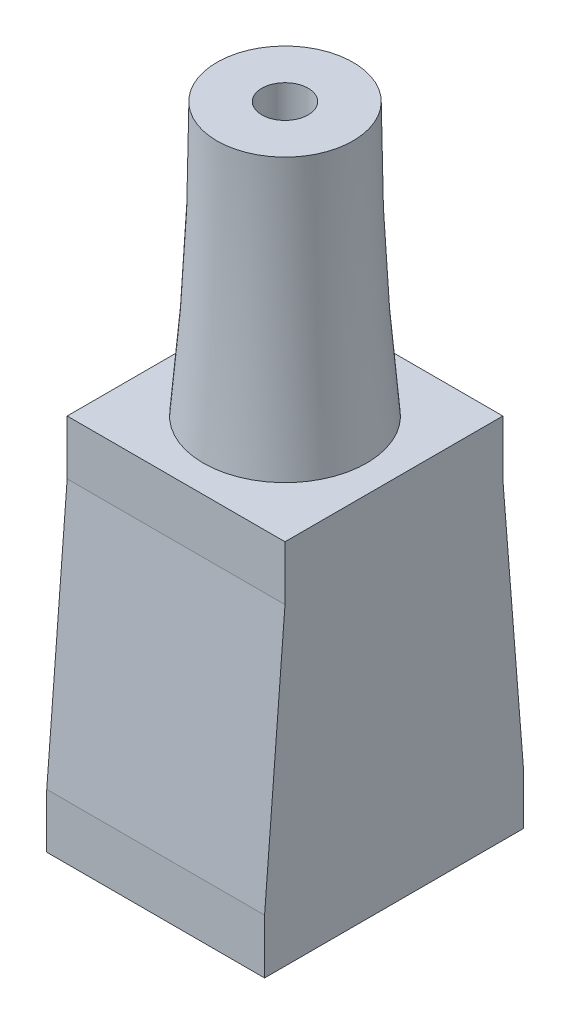
ISO-10303-21;
HEADER;
FILE_DESCRIPTION(('STEP AP214'),'2;1');
FILE_NAME('part.step','',(''),(''),'','','');
FILE_SCHEMA(('AUTOMOTIVE_DESIGN { 1 0 10303 214 1 1 1 1 }'));
ENDSEC;
DATA;
#1=APPLICATION_CONTEXT('core data for automotive mechanical design processes');
#2=APPLICATION_PROTOCOL_DEFINITION('international standard','automotive_design',2000,#1);
#3=PRODUCT_CONTEXT('',#1,'mechanical');
#4=PRODUCT('Part','Part','',(#3));
#5=PRODUCT_RELATED_PRODUCT_CATEGORY('part','',(#4));
#6=PRODUCT_DEFINITION_FORMATION('','',#4);
#7=PRODUCT_DEFINITION_CONTEXT('part definition',#1,'design');
#8=PRODUCT_DEFINITION('design','',#6,#7);
#9=PRODUCT_DEFINITION_SHAPE('','',#8);
#10=(LENGTH_UNIT() NAMED_UNIT(*) SI_UNIT(.MILLI.,.METRE.));
#11=(NAMED_UNIT(*) PLANE_ANGLE_UNIT() SI_UNIT($,.RADIAN.));
#12=(NAMED_UNIT(*) SI_UNIT($,.STERADIAN.) SOLID_ANGLE_UNIT());
#13=UNCERTAINTY_MEASURE_WITH_UNIT(LENGTH_MEASURE(1.E-05),#10,'distance_accuracy_value','');
#14=(GEOMETRIC_REPRESENTATION_CONTEXT(3) GLOBAL_UNCERTAINTY_ASSIGNED_CONTEXT((#13)) GLOBAL_UNIT_ASSIGNED_CONTEXT((#10,
#11,#12)) REPRESENTATION_CONTEXT('',''));
#15=CARTESIAN_POINT('',(0.,0.,0.));
#16=DIRECTION('',(0.,0.,1.));
#17=DIRECTION('',(1.,0.,0.));
#18=AXIS2_PLACEMENT_3D('',#15,#16,#17);
#19=CARTESIAN_POINT('',(0.,0.,0.));
#20=DIRECTION('',(0.,1.,0.));
#21=DIRECTION('',(0.,0.,1.));
#22=AXIS2_PLACEMENT_3D('',#19,#20,#21);
#23=CYLINDRICAL_SURFACE('',#22,0.85);
#24=CARTESIAN_POINT('',(0.,13.5,0.));
#25=DIRECTION('',(0.,1.,0.));
#26=DIRECTION('',(0.,0.,1.));
#27=AXIS2_PLACEMENT_3D('',#24,#25,#26);
#28=CIRCLE('',#27,0.85);
#29=CARTESIAN_POINT('',(0.,13.5,0.85));
#30=VERTEX_POINT('',#29);
#31=EDGE_CURVE('E44',#30,#30,#28,.T.);
#32=ORIENTED_EDGE('',*,*,#31,.T.);
#33=EDGE_LOOP('',(#32));
#34=FACE_BOUND('',#33,.T.);
#35=CARTESIAN_POINT('',(0.,23.5,0.));
#36=DIRECTION('',(0.,1.,0.));
#37=DIRECTION('',(0.,0.,1.));
#38=AXIS2_PLACEMENT_3D('',#35,#36,#37);
#39=CIRCLE('',#38,0.85);
#40=CARTESIAN_POINT('',(0.,23.5,0.85));
#41=VERTEX_POINT('',#40);
#42=EDGE_CURVE('E54',#41,#41,#39,.T.);
#43=ORIENTED_EDGE('',*,*,#42,.F.);
#44=EDGE_LOOP('',(#43));
#45=FACE_BOUND('',#44,.T.);
#46=ADVANCED_FACE('F41',(#34,#45),#23,.T.);
#47=CARTESIAN_POINT('',(0.85,23.5,0.));
#48=DIRECTION('',(0.,-1.,0.));
#49=DIRECTION('',(0.,0.,-1.));
#50=AXIS2_PLACEMENT_3D('',#47,#48,#49);
#51=PLANE('',#50);
#52=ORIENTED_EDGE('',*,*,#42,.T.);
#53=EDGE_LOOP('',(#52));
#54=FACE_BOUND('',#53,.T.);
#55=CARTESIAN_POINT('',(0.,23.5,0.));
#56=DIRECTION('',(0.,1.,0.));
#57=DIRECTION('',(0.,0.,1.));
#58=AXIS2_PLACEMENT_3D('',#55,#56,#57);
#59=CIRCLE('',#58,2.5);
#60=CARTESIAN_POINT('',(0.,23.5,2.5));
#61=VERTEX_POINT('',#60);
#62=EDGE_CURVE('E48',#61,#61,#59,.T.);
#63=ORIENTED_EDGE('',*,*,#62,.F.);
#64=EDGE_LOOP('',(#63));
#65=FACE_BOUND('',#64,.T.);
#66=ADVANCED_FACE('F69',(#54,#65),#51,.T.);
#67=CARTESIAN_POINT('',(0.,23.5,0.));
#68=DIRECTION('',(0.,1.,0.));
#69=DIRECTION('',(0.,0.,1.));
#70=AXIS2_PLACEMENT_3D('',#67,#68,#69);
#71=TOROIDAL_SURFACE('',#70,102.75,100.25);
#72=ORIENTED_EDGE('',*,*,#62,.T.);
#73=EDGE_LOOP('',(#72));
#74=FACE_BOUND('',#73,.T.);
#75=CARTESIAN_POINT('',(0.,13.4999999999999,0.));
#76=DIRECTION('',(0.,1.,0.));
#77=DIRECTION('',(0.,0.,1.));
#78=AXIS2_PLACEMENT_3D('',#75,#76,#77);
#79=CIRCLE('',#78,3.);
#80=CARTESIAN_POINT('',(0.,13.4999999999999,3.));
#81=VERTEX_POINT('',#80);
#82=EDGE_CURVE('E11',#81,#81,#79,.T.);
#83=ORIENTED_EDGE('',*,*,#82,.F.);
#84=EDGE_LOOP('',(#83));
#85=FACE_BOUND('',#84,.T.);
#86=ADVANCED_FACE('F64',(#74,#85),#71,.T.);
#87=CARTESIAN_POINT('',(0.85,13.5,0.));
#88=DIRECTION('',(0.,1.,0.));
#89=DIRECTION('',(0.,0.,1.));
#90=AXIS2_PLACEMENT_3D('',#87,#88,#89);
#91=PLANE('',#90);
#92=ORIENTED_EDGE('',*,*,#82,.T.);
#93=EDGE_LOOP('',(#92));
#94=FACE_BOUND('',#93,.T.);
#95=ORIENTED_EDGE('',*,*,#31,.F.);
#96=EDGE_LOOP('',(#95));
#97=FACE_BOUND('',#96,.T.);
#98=ADVANCED_FACE('F42',(#94,#97),#91,.T.);
#99=OPEN_SHELL('',(#46,#66,#86,#98));
#100=SHELL_BASED_SURFACE_MODEL('B2',(#99));
#101=CARTESIAN_POINT('',(-4.,13.5,-4.));
#102=DIRECTION('',(0.,0.,1.));
#103=DIRECTION('',(1.,0.,0.));
#104=AXIS2_PLACEMENT_3D('',#101,#102,#103);
#105=PLANE('',#104);
#106=DIRECTION('',(1.,0.,0.));
#107=VECTOR('',#106,1.);
#108=CARTESIAN_POINT('',(-4.,13.5,-4.));
#109=LINE('',#108,#107);
#110=CARTESIAN_POINT('',(-4.,13.5,-4.));
#111=VERTEX_POINT('',#110);
#112=CARTESIAN_POINT('',(4.,13.5,-4.));
#113=VERTEX_POINT('',#112);
#114=EDGE_CURVE('E185',#111,#113,#109,.T.);
#115=ORIENTED_EDGE('',*,*,#114,.T.);
#116=DIRECTION('',(0.,-1.,0.));
#117=VECTOR('',#116,1.);
#118=CARTESIAN_POINT('',(4.,13.5,-4.));
#119=LINE('',#118,#117);
#120=CARTESIAN_POINT('',(4.,11.5,-4.));
#121=VERTEX_POINT('',#120);
#122=EDGE_CURVE('E179',#113,#121,#119,.T.);
#123=ORIENTED_EDGE('',*,*,#122,.T.);
#124=DIRECTION('',(1.,0.,0.));
#125=VECTOR('',#124,1.);
#126=CARTESIAN_POINT('',(-4.,11.5,-4.));
#127=LINE('',#126,#125);
#128=CARTESIAN_POINT('',(-4.,11.5,-4.));
#129=VERTEX_POINT('',#128);
#130=EDGE_CURVE('E39',#129,#121,#127,.T.);
#131=ORIENTED_EDGE('',*,*,#130,.F.);
#132=DIRECTION('',(0.,-1.,0.));
#133=VECTOR('',#132,1.);
#134=CARTESIAN_POINT('',(-4.,13.5,-4.));
#135=LINE('',#134,#133);
#136=EDGE_CURVE('E208',#111,#129,#135,.T.);
#137=ORIENTED_EDGE('',*,*,#136,.F.);
#138=EDGE_LOOP('',(#115,#123,#131,#137));
#139=FACE_BOUND('',#138,.T.);
#140=ADVANCED_FACE('F103',(#139),#105,.F.);
#141=CARTESIAN_POINT('',(-4.,11.5,-4.));
#142=DIRECTION('',(0.,-0.0787024854200107,0.996898148653469));
#143=DIRECTION('',(0.,-0.996898148653469,-0.0787024854200107));
#144=AXIS2_PLACEMENT_3D('',#141,#142,#143);
#145=PLANE('',#144);
#146=ORIENTED_EDGE('',*,*,#130,.T.);
#147=DIRECTION('',(0.,-0.996898148653469,-0.0787024854200107));
#148=VECTOR('',#147,1.);
#149=CARTESIAN_POINT('',(4.,11.5,-4.));
#150=LINE('',#149,#148);
#151=CARTESIAN_POINT('',(4.,2.,-4.75));
#152=VERTEX_POINT('',#151);
#153=EDGE_CURVE('E169',#121,#152,#150,.T.);
#154=ORIENTED_EDGE('',*,*,#153,.T.);
#155=DIRECTION('',(1.,0.,0.));
#156=VECTOR('',#155,1.);
#157=CARTESIAN_POINT('',(-4.,2.,-4.75));
#158=LINE('',#157,#156);
#159=CARTESIAN_POINT('',(-4.,2.,-4.75));
#160=VERTEX_POINT('',#159);
#161=EDGE_CURVE('E110',#160,#152,#158,.T.);
#162=ORIENTED_EDGE('',*,*,#161,.F.);
#163=DIRECTION('',(0.,-0.996898148653469,-0.0787024854200107));
#164=VECTOR('',#163,1.);
#165=CARTESIAN_POINT('',(-4.,11.5,-4.));
#166=LINE('',#165,#164);
#167=EDGE_CURVE('E170',#129,#160,#166,.T.);
#168=ORIENTED_EDGE('',*,*,#167,.F.);
#169=EDGE_LOOP('',(#146,#154,#162,#168));
#170=FACE_BOUND('',#169,.T.);
#171=ADVANCED_FACE('F167',(#170),#145,.F.);
#172=CARTESIAN_POINT('',(-4.,2.,-4.75));
#173=DIRECTION('',(0.,0.,1.));
#174=DIRECTION('',(1.,0.,0.));
#175=AXIS2_PLACEMENT_3D('',#172,#173,#174);
#176=PLANE('',#175);
#177=ORIENTED_EDGE('',*,*,#161,.T.);
#178=DIRECTION('',(0.,-1.,0.));
#179=VECTOR('',#178,1.);
#180=CARTESIAN_POINT('',(4.,2.,-4.75));
#181=LINE('',#180,#179);
#182=CARTESIAN_POINT('',(4.,0.,-4.75));
#183=VERTEX_POINT('',#182);
#184=EDGE_CURVE('E183',#152,#183,#181,.T.);
#185=ORIENTED_EDGE('',*,*,#184,.T.);
#186=DIRECTION('',(1.,0.,0.));
#187=VECTOR('',#186,1.);
#188=CARTESIAN_POINT('',(-4.,0.,-4.75));
#189=LINE('',#188,#187);
#190=CARTESIAN_POINT('',(-4.,0.,-4.75));
#191=VERTEX_POINT('',#190);
#192=EDGE_CURVE('E230',#191,#183,#189,.T.);
#193=ORIENTED_EDGE('',*,*,#192,.F.);
#194=DIRECTION('',(0.,-1.,0.));
#195=VECTOR('',#194,1.);
#196=CARTESIAN_POINT('',(-4.,2.,-4.75));
#197=LINE('',#196,#195);
#198=EDGE_CURVE('E211',#160,#191,#197,.T.);
#199=ORIENTED_EDGE('',*,*,#198,.F.);
#200=EDGE_LOOP('',(#177,#185,#193,#199));
#201=FACE_BOUND('',#200,.T.);
#202=ADVANCED_FACE('F233',(#201),#176,.F.);
#203=CARTESIAN_POINT('',(-4.,0.,-4.75));
#204=DIRECTION('',(0.,1.,0.));
#205=DIRECTION('',(0.,0.,1.));
#206=AXIS2_PLACEMENT_3D('',#203,#204,#205);
#207=PLANE('',#206);
#208=CARTESIAN_POINT('',(0.,0.,0.));
#209=DIRECTION('',(0.,1.,0.));
#210=DIRECTION('',(0.,0.,1.));
#211=AXIS2_PLACEMENT_3D('',#208,#209,#210);
#212=CIRCLE('',#211,0.85);
#213=CARTESIAN_POINT('',(0.,0.,0.85));
#214=VERTEX_POINT('',#213);
#215=EDGE_CURVE('E186',#214,#214,#212,.T.);
#216=ORIENTED_EDGE('',*,*,#215,.T.);
#217=EDGE_LOOP('',(#216));
#218=FACE_BOUND('',#217,.T.);
#219=ORIENTED_EDGE('',*,*,#192,.T.);
#220=DIRECTION('',(0.,0.,1.));
#221=VECTOR('',#220,1.);
#222=CARTESIAN_POINT('',(4.,0.,-4.75));
#223=LINE('',#222,#221);
#224=CARTESIAN_POINT('',(4.,0.,4.75));
#225=VERTEX_POINT('',#224);
#226=EDGE_CURVE('E194',#183,#225,#223,.T.);
#227=ORIENTED_EDGE('',*,*,#226,.T.);
#228=DIRECTION('',(1.,0.,0.));
#229=VECTOR('',#228,1.);
#230=CARTESIAN_POINT('',(-4.,0.,4.75));
#231=LINE('',#230,#229);
#232=CARTESIAN_POINT('',(-4.,0.,4.75));
#233=VERTEX_POINT('',#232);
#234=EDGE_CURVE('E228',#233,#225,#231,.T.);
#235=ORIENTED_EDGE('',*,*,#234,.F.);
#236=DIRECTION('',(0.,0.,1.));
#237=VECTOR('',#236,1.);
#238=CARTESIAN_POINT('',(-4.,0.,-4.75));
#239=LINE('',#238,#237);
#240=EDGE_CURVE('E213',#191,#233,#239,.T.);
#241=ORIENTED_EDGE('',*,*,#240,.F.);
#242=EDGE_LOOP('',(#219,#227,#235,#241));
#243=FACE_BOUND('',#242,.T.);
#244=ADVANCED_FACE('F241',(#218,#243),#207,.F.);
#245=CARTESIAN_POINT('',(-4.,0.,4.75));
#246=DIRECTION('',(0.,0.,-1.));
#247=DIRECTION('',(-1.,0.,0.));
#248=AXIS2_PLACEMENT_3D('',#245,#246,#247);
#249=PLANE('',#248);
#250=ORIENTED_EDGE('',*,*,#234,.T.);
#251=DIRECTION('',(0.,1.,0.));
#252=VECTOR('',#251,1.);
#253=CARTESIAN_POINT('',(4.,0.,4.75));
#254=LINE('',#253,#252);
#255=CARTESIAN_POINT('',(4.,2.,4.75));
#256=VERTEX_POINT('',#255);
#257=EDGE_CURVE('E197',#225,#256,#254,.T.);
#258=ORIENTED_EDGE('',*,*,#257,.T.);
#259=DIRECTION('',(1.,0.,0.));
#260=VECTOR('',#259,1.);
#261=CARTESIAN_POINT('',(-4.,2.,4.75));
#262=LINE('',#261,#260);
#263=CARTESIAN_POINT('',(-4.,2.,4.75));
#264=VERTEX_POINT('',#263);
#265=EDGE_CURVE('E226',#264,#256,#262,.T.);
#266=ORIENTED_EDGE('',*,*,#265,.F.);
#267=DIRECTION('',(0.,1.,0.));
#268=VECTOR('',#267,1.);
#269=CARTESIAN_POINT('',(-4.,0.,4.75));
#270=LINE('',#269,#268);
#271=EDGE_CURVE('E215',#233,#264,#270,.T.);
#272=ORIENTED_EDGE('',*,*,#271,.F.);
#273=EDGE_LOOP('',(#250,#258,#266,#272));
#274=FACE_BOUND('',#273,.T.);
#275=ADVANCED_FACE('F244',(#274),#249,.F.);
#276=CARTESIAN_POINT('',(-4.,2.,4.75));
#277=DIRECTION('',(0.,-0.0787024854200107,-0.996898148653469));
#278=DIRECTION('',(0.,0.996898148653469,-0.0787024854200107));
#279=AXIS2_PLACEMENT_3D('',#276,#277,#278);
#280=PLANE('',#279);
#281=ORIENTED_EDGE('',*,*,#265,.T.);
#282=DIRECTION('',(0.,0.996898148653469,-0.0787024854200107));
#283=VECTOR('',#282,1.);
#284=CARTESIAN_POINT('',(4.,2.,4.75));
#285=LINE('',#284,#283);
#286=CARTESIAN_POINT('',(4.,11.5,4.));
#287=VERTEX_POINT('',#286);
#288=EDGE_CURVE('E200',#256,#287,#285,.T.);
#289=ORIENTED_EDGE('',*,*,#288,.T.);
#290=DIRECTION('',(1.,0.,0.));
#291=VECTOR('',#290,1.);
#292=CARTESIAN_POINT('',(-4.,11.5,4.));
#293=LINE('',#292,#291);
#294=CARTESIAN_POINT('',(-4.,11.5,4.));
#295=VERTEX_POINT('',#294);
#296=EDGE_CURVE('E224',#295,#287,#293,.T.);
#297=ORIENTED_EDGE('',*,*,#296,.F.);
#298=DIRECTION('',(0.,0.996898148653469,-0.0787024854200107));
#299=VECTOR('',#298,1.);
#300=CARTESIAN_POINT('',(-4.,2.,4.75));
#301=LINE('',#300,#299);
#302=EDGE_CURVE('E217',#264,#295,#301,.T.);
#303=ORIENTED_EDGE('',*,*,#302,.F.);
#304=EDGE_LOOP('',(#281,#289,#297,#303));
#305=FACE_BOUND('',#304,.T.);
#306=ADVANCED_FACE('F249',(#305),#280,.F.);
#307=CARTESIAN_POINT('',(-4.,11.5,4.));
#308=DIRECTION('',(0.,0.,-1.));
#309=DIRECTION('',(-1.,0.,0.));
#310=AXIS2_PLACEMENT_3D('',#307,#308,#309);
#311=PLANE('',#310);
#312=ORIENTED_EDGE('',*,*,#296,.T.);
#313=DIRECTION('',(0.,1.,0.));
#314=VECTOR('',#313,1.);
#315=CARTESIAN_POINT('',(4.,11.5,4.));
#316=LINE('',#315,#314);
#317=CARTESIAN_POINT('',(4.,13.5,4.));
#318=VERTEX_POINT('',#317);
#319=EDGE_CURVE('E203',#287,#318,#316,.T.);
#320=ORIENTED_EDGE('',*,*,#319,.T.);
#321=DIRECTION('',(1.,0.,0.));
#322=VECTOR('',#321,1.);
#323=CARTESIAN_POINT('',(-4.,13.5,4.));
#324=LINE('',#323,#322);
#325=CARTESIAN_POINT('',(-4.,13.5,4.));
#326=VERTEX_POINT('',#325);
#327=EDGE_CURVE('E222',#326,#318,#324,.T.);
#328=ORIENTED_EDGE('',*,*,#327,.F.);
#329=DIRECTION('',(0.,1.,0.));
#330=VECTOR('',#329,1.);
#331=CARTESIAN_POINT('',(-4.,11.5,4.));
#332=LINE('',#331,#330);
#333=EDGE_CURVE('E122',#295,#326,#332,.T.);
#334=ORIENTED_EDGE('',*,*,#333,.F.);
#335=EDGE_LOOP('',(#312,#320,#328,#334));
#336=FACE_BOUND('',#335,.T.);
#337=ADVANCED_FACE('F252',(#336),#311,.F.);
#338=CARTESIAN_POINT('',(-4.,13.5,4.));
#339=DIRECTION('',(0.,-1.,0.));
#340=DIRECTION('',(0.,0.,-1.));
#341=AXIS2_PLACEMENT_3D('',#338,#339,#340);
#342=PLANE('',#341);
#343=CARTESIAN_POINT('',(0.,13.5,0.));
#344=DIRECTION('',(0.,1.,0.));
#345=DIRECTION('',(0.,0.,1.));
#346=AXIS2_PLACEMENT_3D('',#343,#344,#345);
#347=CIRCLE('',#346,0.85);
#348=CARTESIAN_POINT('',(0.,13.5,0.85));
#349=VERTEX_POINT('',#348);
#350=EDGE_CURVE('E189',#349,#349,#347,.T.);
#351=ORIENTED_EDGE('',*,*,#350,.F.);
#352=EDGE_LOOP('',(#351));
#353=FACE_BOUND('',#352,.T.);
#354=ORIENTED_EDGE('',*,*,#327,.T.);
#355=DIRECTION('',(0.,0.,-1.));
#356=VECTOR('',#355,1.);
#357=CARTESIAN_POINT('',(4.,13.5,4.));
#358=LINE('',#357,#356);
#359=EDGE_CURVE('E206',#318,#113,#358,.T.);
#360=ORIENTED_EDGE('',*,*,#359,.T.);
#361=ORIENTED_EDGE('',*,*,#114,.F.);
#362=DIRECTION('',(0.,0.,-1.));
#363=VECTOR('',#362,1.);
#364=CARTESIAN_POINT('',(-4.,13.5,4.));
#365=LINE('',#364,#363);
#366=EDGE_CURVE('E117',#326,#111,#365,.T.);
#367=ORIENTED_EDGE('',*,*,#366,.F.);
#368=EDGE_LOOP('',(#354,#360,#361,#367));
#369=FACE_BOUND('',#368,.T.);
#370=ADVANCED_FACE('F254',(#353,#369),#342,.F.);
#371=CARTESIAN_POINT('',(-4.,0.,0.));
#372=DIRECTION('',(-1.,0.,0.));
#373=DIRECTION('',(0.,0.,1.));
#374=AXIS2_PLACEMENT_3D('',#371,#372,#373);
#375=PLANE('',#374);
#376=ORIENTED_EDGE('',*,*,#136,.T.);
#377=ORIENTED_EDGE('',*,*,#167,.T.);
#378=ORIENTED_EDGE('',*,*,#198,.T.);
#379=ORIENTED_EDGE('',*,*,#240,.T.);
#380=ORIENTED_EDGE('',*,*,#271,.T.);
#381=ORIENTED_EDGE('',*,*,#302,.T.);
#382=ORIENTED_EDGE('',*,*,#333,.T.);
#383=ORIENTED_EDGE('',*,*,#366,.T.);
#384=EDGE_LOOP('',(#376,#377,#378,#379,#380,#381,#382,#383));
#385=FACE_BOUND('',#384,.T.);
#386=ADVANCED_FACE('F236',(#385),#375,.T.);
#387=CARTESIAN_POINT('',(4.,0.,0.));
#388=DIRECTION('',(-1.,0.,0.));
#389=DIRECTION('',(0.,0.,1.));
#390=AXIS2_PLACEMENT_3D('',#387,#388,#389);
#391=PLANE('',#390);
#392=ORIENTED_EDGE('',*,*,#122,.F.);
#393=ORIENTED_EDGE('',*,*,#359,.F.);
#394=ORIENTED_EDGE('',*,*,#319,.F.);
#395=ORIENTED_EDGE('',*,*,#288,.F.);
#396=ORIENTED_EDGE('',*,*,#257,.F.);
#397=ORIENTED_EDGE('',*,*,#226,.F.);
#398=ORIENTED_EDGE('',*,*,#184,.F.);
#399=ORIENTED_EDGE('',*,*,#153,.F.);
#400=EDGE_LOOP('',(#392,#393,#394,#395,#396,#397,#398,#399));
#401=FACE_BOUND('',#400,.T.);
#402=ADVANCED_FACE('F177',(#401),#391,.F.);
#403=CARTESIAN_POINT('',(0.,0.,0.));
#404=DIRECTION('',(0.,1.,0.));
#405=DIRECTION('',(0.,0.,1.));
#406=AXIS2_PLACEMENT_3D('',#403,#404,#405);
#407=CYLINDRICAL_SURFACE('',#406,0.85);
#408=ORIENTED_EDGE('',*,*,#215,.F.);
#409=EDGE_LOOP('',(#408));
#410=FACE_BOUND('',#409,.T.);
#411=ORIENTED_EDGE('',*,*,#350,.T.);
#412=EDGE_LOOP('',(#411));
#413=FACE_BOUND('',#412,.T.);
#414=ADVANCED_FACE('F304',(#410,#413),#407,.F.);
#415=CLOSED_SHELL('',(#140,#171,#202,#244,#275,#306,#337,#370,#386,#402,#414));
#416=MANIFOLD_SOLID_BREP('B6',#415);
#417=ADVANCED_BREP_SHAPE_REPRESENTATION('',(#18,#416),#14);
#418=MANIFOLD_SURFACE_SHAPE_REPRESENTATION('',(#18,#100),#14);
#419=SHAPE_REPRESENTATION('',(#18),#14);
#420=SHAPE_DEFINITION_REPRESENTATION(#9,#419);
#421=SHAPE_REPRESENTATION_RELATIONSHIP('','',#419,#417);
#422=SHAPE_REPRESENTATION_RELATIONSHIP('','',#419,#418);
ENDSEC;
END-ISO-10303-21;
